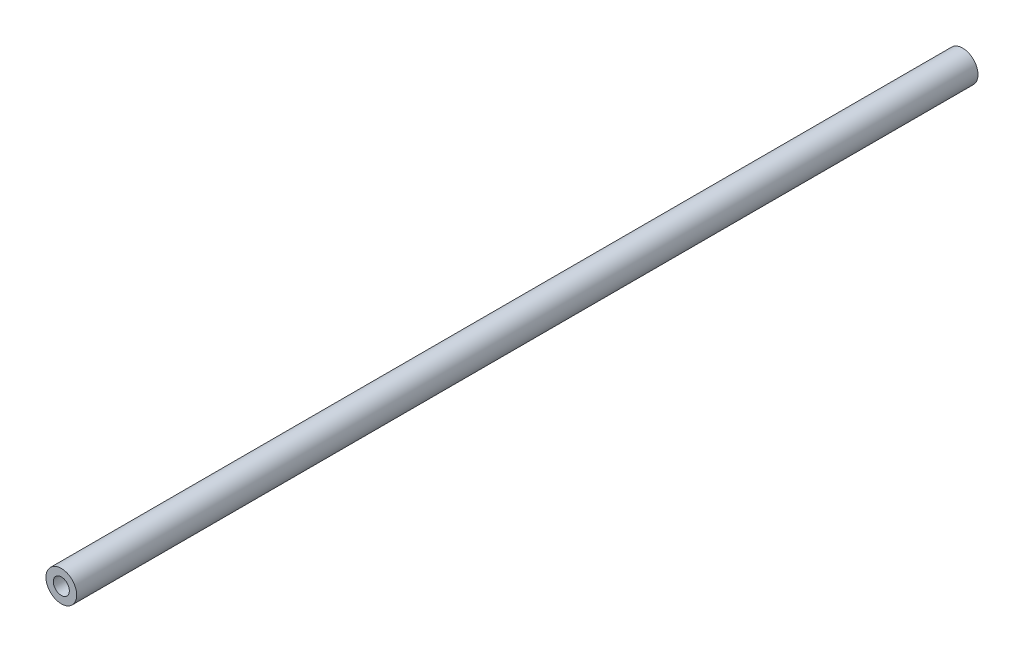
ISO-10303-21;
HEADER;
FILE_DESCRIPTION(('STEP AP214'),'2;1');
FILE_NAME('part.step','',(''),(''),'','','');
FILE_SCHEMA(('AUTOMOTIVE_DESIGN { 1 0 10303 214 1 1 1 1 }'));
ENDSEC;
DATA;
#1=APPLICATION_CONTEXT('core data for automotive mechanical design processes');
#2=APPLICATION_PROTOCOL_DEFINITION('international standard','automotive_design',2000,#1);
#3=PRODUCT_CONTEXT('',#1,'mechanical');
#4=PRODUCT('Part','Part','',(#3));
#5=PRODUCT_RELATED_PRODUCT_CATEGORY('part','',(#4));
#6=PRODUCT_DEFINITION_FORMATION('','',#4);
#7=PRODUCT_DEFINITION_CONTEXT('part definition',#1,'design');
#8=PRODUCT_DEFINITION('design','',#6,#7);
#9=PRODUCT_DEFINITION_SHAPE('','',#8);
#10=(LENGTH_UNIT() NAMED_UNIT(*) SI_UNIT(.MILLI.,.METRE.));
#11=(NAMED_UNIT(*) PLANE_ANGLE_UNIT() SI_UNIT($,.RADIAN.));
#12=(NAMED_UNIT(*) SI_UNIT($,.STERADIAN.) SOLID_ANGLE_UNIT());
#13=UNCERTAINTY_MEASURE_WITH_UNIT(LENGTH_MEASURE(1.E-05),#10,'distance_accuracy_value','');
#14=(GEOMETRIC_REPRESENTATION_CONTEXT(3) GLOBAL_UNCERTAINTY_ASSIGNED_CONTEXT((#13)) GLOBAL_UNIT_ASSIGNED_CONTEXT((#10,
#11,#12)) REPRESENTATION_CONTEXT('',''));
#15=CARTESIAN_POINT('',(0.,0.,0.));
#16=DIRECTION('',(0.,0.,1.));
#17=DIRECTION('',(1.,0.,0.));
#18=AXIS2_PLACEMENT_3D('',#15,#16,#17);
#19=CARTESIAN_POINT('',(53.2196672547487,506.476,-279.4));
#20=DIRECTION('',(0.,0.,1.));
#21=DIRECTION('',(1.,0.,0.));
#22=AXIS2_PLACEMENT_3D('',#19,#20,#21);
#23=CYLINDRICAL_SURFACE('',#22,4.76250000000088);
#24=CARTESIAN_POINT('',(53.2196672547487,506.476,-279.4));
#25=DIRECTION('',(0.,0.,1.));
#26=DIRECTION('',(1.,0.,0.));
#27=AXIS2_PLACEMENT_3D('',#24,#25,#26);
#28=CIRCLE('',#27,4.76250000000088);
#29=CARTESIAN_POINT('',(57.9821672547496,506.476,-279.4));
#30=VERTEX_POINT('',#29);
#31=EDGE_CURVE('E10',#30,#30,#28,.T.);
#32=ORIENTED_EDGE('',*,*,#31,.T.);
#33=EDGE_LOOP('',(#32));
#34=FACE_BOUND('',#33,.T.);
#35=CARTESIAN_POINT('',(53.2196672547487,506.476,0.));
#36=DIRECTION('',(0.,0.,1.));
#37=DIRECTION('',(1.,0.,0.));
#38=AXIS2_PLACEMENT_3D('',#35,#36,#37);
#39=CIRCLE('',#38,4.76250000000088);
#40=CARTESIAN_POINT('',(57.9821672547496,506.476,0.));
#41=VERTEX_POINT('',#40);
#42=EDGE_CURVE('E40',#41,#41,#39,.T.);
#43=ORIENTED_EDGE('',*,*,#42,.F.);
#44=EDGE_LOOP('',(#43));
#45=FACE_BOUND('',#44,.T.);
#46=ADVANCED_FACE('F37',(#34,#45),#23,.T.);
#47=CARTESIAN_POINT('',(53.2196672547487,506.476,-279.4));
#48=DIRECTION('',(0.,0.,1.));
#49=DIRECTION('',(1.,0.,0.));
#50=AXIS2_PLACEMENT_3D('',#47,#48,#49);
#51=PLANE('',#50);
#52=CARTESIAN_POINT('',(53.2196672547487,506.476,-279.4));
#53=DIRECTION('',(0.,0.,1.));
#54=DIRECTION('',(1.,0.,0.));
#55=AXIS2_PLACEMENT_3D('',#52,#53,#54);
#56=CIRCLE('',#55,2.48920000000086);
#57=CARTESIAN_POINT('',(55.7088672547496,506.476,-279.4));
#58=VERTEX_POINT('',#57);
#59=EDGE_CURVE('E47',#58,#58,#56,.T.);
#60=ORIENTED_EDGE('',*,*,#59,.T.);
#61=EDGE_LOOP('',(#60));
#62=FACE_BOUND('',#61,.T.);
#63=ORIENTED_EDGE('',*,*,#31,.F.);
#64=EDGE_LOOP('',(#63));
#65=FACE_BOUND('',#64,.T.);
#66=ADVANCED_FACE('F55',(#62,#65),#51,.F.);
#67=CARTESIAN_POINT('',(53.2196672547487,506.476,0.));
#68=DIRECTION('',(0.,0.,1.));
#69=DIRECTION('',(1.,0.,0.));
#70=AXIS2_PLACEMENT_3D('',#67,#68,#69);
#71=PLANE('',#70);
#72=CARTESIAN_POINT('',(53.2196672547487,506.476,0.));
#73=DIRECTION('',(0.,0.,1.));
#74=DIRECTION('',(1.,0.,0.));
#75=AXIS2_PLACEMENT_3D('',#72,#73,#74);
#76=CIRCLE('',#75,2.48920000000086);
#77=CARTESIAN_POINT('',(55.7088672547496,506.476,0.));
#78=VERTEX_POINT('',#77);
#79=EDGE_CURVE('E49',#78,#78,#76,.T.);
#80=ORIENTED_EDGE('',*,*,#79,.F.);
#81=EDGE_LOOP('',(#80));
#82=FACE_BOUND('',#81,.T.);
#83=ORIENTED_EDGE('',*,*,#42,.T.);
#84=EDGE_LOOP('',(#83));
#85=FACE_BOUND('',#84,.T.);
#86=ADVANCED_FACE('F61',(#82,#85),#71,.T.);
#87=CARTESIAN_POINT('',(53.2196672547487,506.476,-279.4));
#88=DIRECTION('',(0.,0.,1.));
#89=DIRECTION('',(1.,0.,0.));
#90=AXIS2_PLACEMENT_3D('',#87,#88,#89);
#91=CYLINDRICAL_SURFACE('',#90,2.48920000000086);
#92=ORIENTED_EDGE('',*,*,#59,.F.);
#93=EDGE_LOOP('',(#92));
#94=FACE_BOUND('',#93,.T.);
#95=ORIENTED_EDGE('',*,*,#79,.T.);
#96=EDGE_LOOP('',(#95));
#97=FACE_BOUND('',#96,.T.);
#98=ADVANCED_FACE('F58',(#94,#97),#91,.F.);
#99=CLOSED_SHELL('',(#46,#66,#86,#98));
#100=MANIFOLD_SOLID_BREP('B2',#99);
#101=ADVANCED_BREP_SHAPE_REPRESENTATION('',(#18,#100),#14);
#102=SHAPE_DEFINITION_REPRESENTATION(#9,#101);
ENDSEC;
END-ISO-10303-21;
